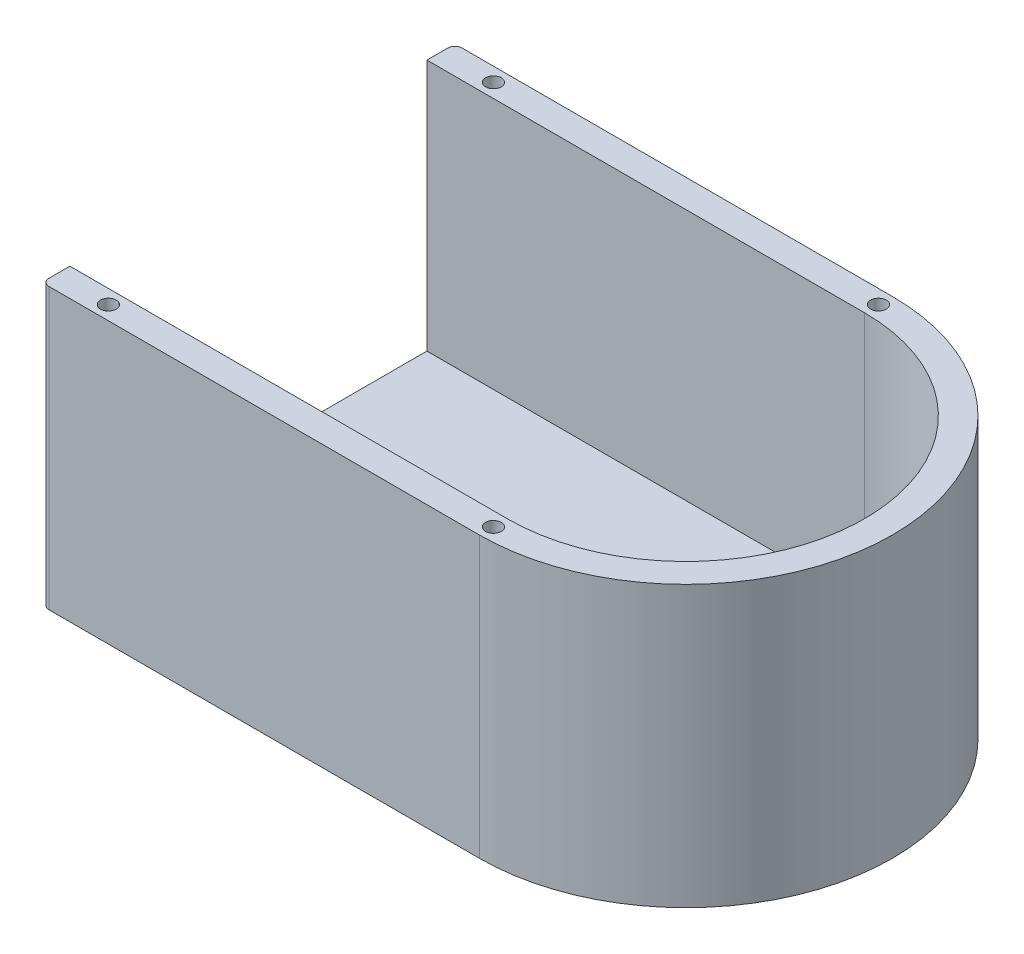
ISO-10303-21;
HEADER;
FILE_DESCRIPTION(('STEP AP214'),'2;1');
FILE_NAME('part.step','',(''),(''),'','','');
FILE_SCHEMA(('AUTOMOTIVE_DESIGN { 1 0 10303 214 1 1 1 1 }'));
ENDSEC;
DATA;
#1=APPLICATION_CONTEXT('core data for automotive mechanical design processes');
#2=APPLICATION_PROTOCOL_DEFINITION('international standard','automotive_design',2000,#1);
#3=PRODUCT_CONTEXT('',#1,'mechanical');
#4=PRODUCT('Part','Part','',(#3));
#5=PRODUCT_RELATED_PRODUCT_CATEGORY('part','',(#4));
#6=PRODUCT_DEFINITION_FORMATION('','',#4);
#7=PRODUCT_DEFINITION_CONTEXT('part definition',#1,'design');
#8=PRODUCT_DEFINITION('design','',#6,#7);
#9=PRODUCT_DEFINITION_SHAPE('','',#8);
#10=(LENGTH_UNIT() NAMED_UNIT(*) SI_UNIT(.MILLI.,.METRE.));
#11=(NAMED_UNIT(*) PLANE_ANGLE_UNIT() SI_UNIT($,.RADIAN.));
#12=(NAMED_UNIT(*) SI_UNIT($,.STERADIAN.) SOLID_ANGLE_UNIT());
#13=UNCERTAINTY_MEASURE_WITH_UNIT(LENGTH_MEASURE(1.E-05),#10,'distance_accuracy_value','');
#14=(GEOMETRIC_REPRESENTATION_CONTEXT(3) GLOBAL_UNCERTAINTY_ASSIGNED_CONTEXT((#13)) GLOBAL_UNIT_ASSIGNED_CONTEXT((#10,
#11,#12)) REPRESENTATION_CONTEXT('',''));
#15=CARTESIAN_POINT('',(0.,0.,0.));
#16=DIRECTION('',(0.,0.,1.));
#17=DIRECTION('',(1.,0.,0.));
#18=AXIS2_PLACEMENT_3D('',#15,#16,#17);
#19=CARTESIAN_POINT('',(-125.,80.,-59.));
#20=DIRECTION('',(1.,0.,0.));
#21=DIRECTION('',(0.,0.,-1.));
#22=AXIS2_PLACEMENT_3D('',#19,#20,#21);
#23=PLANE('',#22);
#24=DIRECTION('',(0.,0.,1.));
#25=VECTOR('',#24,1.);
#26=CARTESIAN_POINT('',(-125.,0.,-59.));
#27=LINE('',#26,#25);
#28=CARTESIAN_POINT('',(-125.,0.,-57.));
#29=VERTEX_POINT('',#28);
#30=CARTESIAN_POINT('',(-125.,0.,57.));
#31=VERTEX_POINT('',#30);
#32=EDGE_CURVE('E197',#29,#31,#27,.T.);
#33=ORIENTED_EDGE('',*,*,#32,.T.);
#34=DIRECTION('',(0.,-1.,0.));
#35=VECTOR('',#34,1.);
#36=CARTESIAN_POINT('',(-125.,80.,57.));
#37=LINE('',#36,#35);
#38=CARTESIAN_POINT('',(-125.,3.96922359359556,57.));
#39=VERTEX_POINT('',#38);
#40=EDGE_CURVE('E608',#31,#39,#37,.F.);
#41=ORIENTED_EDGE('',*,*,#40,.T.);
#42=CARTESIAN_POINT('',(-125.,5.,55.));
#43=DIRECTION('',(-1.,0.,0.));
#44=DIRECTION('',(0.,0.,1.));
#45=AXIS2_PLACEMENT_3D('',#42,#43,#44);
#46=CIRCLE('',#45,2.25);
#47=CARTESIAN_POINT('',(-125.,6.03077640640445,57.));
#48=VERTEX_POINT('',#47);
#49=EDGE_CURVE('E536',#48,#39,#46,.T.);
#50=ORIENTED_EDGE('',*,*,#49,.F.);
#51=DIRECTION('',(0.,-1.,0.));
#52=VECTOR('',#51,1.);
#53=CARTESIAN_POINT('',(-125.,80.,57.));
#54=LINE('',#53,#52);
#55=CARTESIAN_POINT('',(-125.,68.9692235935956,57.));
#56=VERTEX_POINT('',#55);
#57=EDGE_CURVE('E71',#48,#56,#54,.F.);
#58=ORIENTED_EDGE('',*,*,#57,.T.);
#59=CARTESIAN_POINT('',(-125.,70.,55.));
#60=DIRECTION('',(-1.,0.,0.));
#61=DIRECTION('',(0.,0.,1.));
#62=AXIS2_PLACEMENT_3D('',#59,#60,#61);
#63=CIRCLE('',#62,2.25);
#64=CARTESIAN_POINT('',(-125.,71.0307764064045,57.));
#65=VERTEX_POINT('',#64);
#66=EDGE_CURVE('E530',#65,#56,#63,.T.);
#67=ORIENTED_EDGE('',*,*,#66,.F.);
#68=DIRECTION('',(0.,-1.,0.));
#69=VECTOR('',#68,1.);
#70=CARTESIAN_POINT('',(-125.,80.,57.));
#71=LINE('',#70,#69);
#72=CARTESIAN_POINT('',(-125.,80.,57.));
#73=VERTEX_POINT('',#72);
#74=EDGE_CURVE('E65',#65,#73,#71,.F.);
#75=ORIENTED_EDGE('',*,*,#74,.T.);
#76=DIRECTION('',(0.,0.,1.));
#77=VECTOR('',#76,1.);
#78=CARTESIAN_POINT('',(-125.,80.,-59.));
#79=LINE('',#78,#77);
#80=CARTESIAN_POINT('',(-125.,80.,51.));
#81=VERTEX_POINT('',#80);
#82=EDGE_CURVE('E164',#81,#73,#79,.T.);
#83=ORIENTED_EDGE('',*,*,#82,.F.);
#84=DIRECTION('',(0.,-1.,0.));
#85=VECTOR('',#84,1.);
#86=CARTESIAN_POINT('',(-125.,80.,51.));
#87=LINE('',#86,#85);
#88=CARTESIAN_POINT('',(-125.,8.,51.));
#89=VERTEX_POINT('',#88);
#90=EDGE_CURVE('E181',#81,#89,#87,.T.);
#91=ORIENTED_EDGE('',*,*,#90,.T.);
#92=DIRECTION('',(0.,0.,-1.));
#93=VECTOR('',#92,1.);
#94=CARTESIAN_POINT('',(-125.,8.,-51.));
#95=LINE('',#94,#93);
#96=CARTESIAN_POINT('',(-125.,8.,-51.));
#97=VERTEX_POINT('',#96);
#98=EDGE_CURVE('E180',#89,#97,#95,.T.);
#99=ORIENTED_EDGE('',*,*,#98,.T.);
#100=DIRECTION('',(0.,1.,0.));
#101=VECTOR('',#100,1.);
#102=CARTESIAN_POINT('',(-125.,80.,-51.));
#103=LINE('',#102,#101);
#104=CARTESIAN_POINT('',(-125.,80.,-51.));
#105=VERTEX_POINT('',#104);
#106=EDGE_CURVE('E170',#97,#105,#103,.T.);
#107=ORIENTED_EDGE('',*,*,#106,.T.);
#108=CARTESIAN_POINT('',(-125.,80.,-57.));
#109=VERTEX_POINT('',#108);
#110=EDGE_CURVE('E152',#109,#105,#79,.T.);
#111=ORIENTED_EDGE('',*,*,#110,.F.);
#112=DIRECTION('',(0.,-1.,0.));
#113=VECTOR('',#112,1.);
#114=CARTESIAN_POINT('',(-125.,80.,-57.));
#115=LINE('',#114,#113);
#116=CARTESIAN_POINT('',(-125.,71.0307764064044,-57.));
#117=VERTEX_POINT('',#116);
#118=EDGE_CURVE('E228',#109,#117,#115,.T.);
#119=ORIENTED_EDGE('',*,*,#118,.T.);
#120=CARTESIAN_POINT('',(-125.,70.,-55.));
#121=DIRECTION('',(-1.,0.,0.));
#122=DIRECTION('',(0.,0.,1.));
#123=AXIS2_PLACEMENT_3D('',#120,#121,#122);
#124=CIRCLE('',#123,2.25);
#125=CARTESIAN_POINT('',(-125.,68.9692235935956,-57.));
#126=VERTEX_POINT('',#125);
#127=EDGE_CURVE('E186',#126,#117,#124,.T.);
#128=ORIENTED_EDGE('',*,*,#127,.F.);
#129=DIRECTION('',(0.,-1.,0.));
#130=VECTOR('',#129,1.);
#131=CARTESIAN_POINT('',(-125.,80.,-57.));
#132=LINE('',#131,#130);
#133=CARTESIAN_POINT('',(-125.,6.03077640640439,-57.));
#134=VERTEX_POINT('',#133);
#135=EDGE_CURVE('E226',#126,#134,#132,.T.);
#136=ORIENTED_EDGE('',*,*,#135,.T.);
#137=CARTESIAN_POINT('',(-125.,5.,-55.));
#138=DIRECTION('',(-1.,0.,0.));
#139=DIRECTION('',(0.,0.,1.));
#140=AXIS2_PLACEMENT_3D('',#137,#138,#139);
#141=CIRCLE('',#140,2.25);
#142=CARTESIAN_POINT('',(-125.,3.96922359359561,-57.));
#143=VERTEX_POINT('',#142);
#144=EDGE_CURVE('E547',#143,#134,#141,.T.);
#145=ORIENTED_EDGE('',*,*,#144,.F.);
#146=DIRECTION('',(0.,-1.,0.));
#147=VECTOR('',#146,1.);
#148=CARTESIAN_POINT('',(-125.,80.,-57.));
#149=LINE('',#148,#147);
#150=EDGE_CURVE('E224',#143,#29,#149,.T.);
#151=ORIENTED_EDGE('',*,*,#150,.T.);
#152=EDGE_LOOP('',(#33,#41,#50,#58,#67,#75,#83,#91,#99,#107,#111,#119,#128,#136,#145,#151));
#153=FACE_BOUND('',#152,.T.);
#154=ADVANCED_FACE('F49',(#153),#23,.F.);
#155=CARTESIAN_POINT('',(-125.,80.,59.));
#156=DIRECTION('',(0.,0.,-1.));
#157=DIRECTION('',(-1.,0.,0.));
#158=AXIS2_PLACEMENT_3D('',#155,#156,#157);
#159=PLANE('',#158);
#160=DIRECTION('',(1.,0.,0.));
#161=VECTOR('',#160,1.);
#162=CARTESIAN_POINT('',(-125.,80.,59.));
#163=LINE('',#162,#161);
#164=CARTESIAN_POINT('',(-123.,80.,59.));
#165=VERTEX_POINT('',#164);
#166=CARTESIAN_POINT('',(0.,80.,59.));
#167=VERTEX_POINT('',#166);
#168=EDGE_CURVE('E163',#165,#167,#163,.T.);
#169=ORIENTED_EDGE('',*,*,#168,.F.);
#170=DIRECTION('',(0.,-1.,0.));
#171=VECTOR('',#170,1.);
#172=CARTESIAN_POINT('',(-123.,80.,59.));
#173=LINE('',#172,#171);
#174=CARTESIAN_POINT('',(-123.,0.,59.));
#175=VERTEX_POINT('',#174);
#176=EDGE_CURVE('E601',#165,#175,#173,.T.);
#177=ORIENTED_EDGE('',*,*,#176,.T.);
#178=DIRECTION('',(1.,0.,0.));
#179=VECTOR('',#178,1.);
#180=CARTESIAN_POINT('',(-125.,0.,59.));
#181=LINE('',#180,#179);
#182=CARTESIAN_POINT('',(0.,0.,59.));
#183=VERTEX_POINT('',#182);
#184=EDGE_CURVE('E212',#175,#183,#181,.T.);
#185=ORIENTED_EDGE('',*,*,#184,.T.);
#186=DIRECTION('',(0.,-1.,0.));
#187=VECTOR('',#186,1.);
#188=CARTESIAN_POINT('',(0.,80.,59.));
#189=LINE('',#188,#187);
#190=EDGE_CURVE('E221',#167,#183,#189,.T.);
#191=ORIENTED_EDGE('',*,*,#190,.F.);
#192=EDGE_LOOP('',(#169,#177,#185,#191));
#193=FACE_BOUND('',#192,.T.);
#194=ADVANCED_FACE('F283',(#193),#159,.F.);
#195=CARTESIAN_POINT('',(0.,80.,0.));
#196=DIRECTION('',(0.,-1.,0.));
#197=DIRECTION('',(0.,0.,-1.));
#198=AXIS2_PLACEMENT_3D('',#195,#196,#197);
#199=CYLINDRICAL_SURFACE('',#198,59.);
#200=CARTESIAN_POINT('',(0.,0.,0.));
#201=DIRECTION('',(0.,1.,0.));
#202=DIRECTION('',(0.,0.,1.));
#203=AXIS2_PLACEMENT_3D('',#200,#201,#202);
#204=CIRCLE('',#203,59.);
#205=CARTESIAN_POINT('',(0.,0.,-59.));
#206=VERTEX_POINT('',#205);
#207=EDGE_CURVE('E214',#183,#206,#204,.T.);
#208=ORIENTED_EDGE('',*,*,#207,.T.);
#209=DIRECTION('',(0.,-1.,0.));
#210=VECTOR('',#209,1.);
#211=CARTESIAN_POINT('',(0.,80.,-59.));
#212=LINE('',#211,#210);
#213=CARTESIAN_POINT('',(0.,80.,-59.));
#214=VERTEX_POINT('',#213);
#215=EDGE_CURVE('E210',#214,#206,#212,.T.);
#216=ORIENTED_EDGE('',*,*,#215,.F.);
#217=CARTESIAN_POINT('',(0.,80.,0.));
#218=DIRECTION('',(0.,1.,0.));
#219=DIRECTION('',(0.,0.,1.));
#220=AXIS2_PLACEMENT_3D('',#217,#218,#219);
#221=CIRCLE('',#220,59.);
#222=EDGE_CURVE('E206',#167,#214,#221,.T.);
#223=ORIENTED_EDGE('',*,*,#222,.F.);
#224=ORIENTED_EDGE('',*,*,#190,.T.);
#225=EDGE_LOOP('',(#208,#216,#223,#224));
#226=FACE_BOUND('',#225,.T.);
#227=ADVANCED_FACE('F279',(#226),#199,.T.);
#228=CARTESIAN_POINT('',(-125.,80.,-59.));
#229=DIRECTION('',(0.,0.,1.));
#230=DIRECTION('',(1.,0.,0.));
#231=AXIS2_PLACEMENT_3D('',#228,#229,#230);
#232=PLANE('',#231);
#233=DIRECTION('',(-1.,0.,0.));
#234=VECTOR('',#233,1.);
#235=CARTESIAN_POINT('',(-125.,0.,-59.));
#236=LINE('',#235,#234);
#237=CARTESIAN_POINT('',(-123.,0.,-59.));
#238=VERTEX_POINT('',#237);
#239=EDGE_CURVE('E216',#206,#238,#236,.T.);
#240=ORIENTED_EDGE('',*,*,#239,.T.);
#241=DIRECTION('',(0.,-1.,0.));
#242=VECTOR('',#241,1.);
#243=CARTESIAN_POINT('',(-123.,80.,-59.));
#244=LINE('',#243,#242);
#245=CARTESIAN_POINT('',(-123.,80.,-59.));
#246=VERTEX_POINT('',#245);
#247=EDGE_CURVE('E595',#238,#246,#244,.F.);
#248=ORIENTED_EDGE('',*,*,#247,.T.);
#249=DIRECTION('',(-1.,0.,0.));
#250=VECTOR('',#249,1.);
#251=CARTESIAN_POINT('',(-125.,80.,-59.));
#252=LINE('',#251,#250);
#253=EDGE_CURVE('E208',#214,#246,#252,.T.);
#254=ORIENTED_EDGE('',*,*,#253,.F.);
#255=ORIENTED_EDGE('',*,*,#215,.T.);
#256=EDGE_LOOP('',(#240,#248,#254,#255));
#257=FACE_BOUND('',#256,.T.);
#258=ADVANCED_FACE('F272',(#257),#232,.F.);
#259=CARTESIAN_POINT('',(0.,80.,0.));
#260=DIRECTION('',(0.,1.,0.));
#261=DIRECTION('',(0.,0.,1.));
#262=AXIS2_PLACEMENT_3D('',#259,#260,#261);
#263=PLANE('',#262);
#264=CARTESIAN_POINT('',(0.,80.,55.));
#265=DIRECTION('',(0.,1.,0.));
#266=DIRECTION('',(0.,0.,1.));
#267=AXIS2_PLACEMENT_3D('',#264,#265,#266);
#268=CIRCLE('',#267,2.25);
#269=CARTESIAN_POINT('',(0.,80.,57.25));
#270=VERTEX_POINT('',#269);
#271=EDGE_CURVE('E562',#270,#270,#268,.T.);
#272=ORIENTED_EDGE('',*,*,#271,.F.);
#273=EDGE_LOOP('',(#272));
#274=FACE_BOUND('',#273,.T.);
#275=CARTESIAN_POINT('',(-110.,80.,55.));
#276=DIRECTION('',(0.,1.,0.));
#277=DIRECTION('',(0.,0.,1.));
#278=AXIS2_PLACEMENT_3D('',#275,#276,#277);
#279=CIRCLE('',#278,2.25);
#280=CARTESIAN_POINT('',(-110.,80.,57.25));
#281=VERTEX_POINT('',#280);
#282=EDGE_CURVE('E568',#281,#281,#279,.T.);
#283=ORIENTED_EDGE('',*,*,#282,.F.);
#284=EDGE_LOOP('',(#283));
#285=FACE_BOUND('',#284,.T.);
#286=CARTESIAN_POINT('',(-110.,80.,-55.));
#287=DIRECTION('',(0.,1.,0.));
#288=DIRECTION('',(0.,0.,1.));
#289=AXIS2_PLACEMENT_3D('',#286,#287,#288);
#290=CIRCLE('',#289,2.25);
#291=CARTESIAN_POINT('',(-110.,80.,-52.75));
#292=VERTEX_POINT('',#291);
#293=EDGE_CURVE('E557',#292,#292,#290,.T.);
#294=ORIENTED_EDGE('',*,*,#293,.F.);
#295=EDGE_LOOP('',(#294));
#296=FACE_BOUND('',#295,.T.);
#297=CARTESIAN_POINT('',(0.,80.,-55.));
#298=DIRECTION('',(0.,1.,0.));
#299=DIRECTION('',(0.,0.,1.));
#300=AXIS2_PLACEMENT_3D('',#297,#298,#299);
#301=CIRCLE('',#300,2.25);
#302=CARTESIAN_POINT('',(0.,80.,-52.75));
#303=VERTEX_POINT('',#302);
#304=EDGE_CURVE('E539',#303,#303,#301,.T.);
#305=ORIENTED_EDGE('',*,*,#304,.F.);
#306=EDGE_LOOP('',(#305));
#307=FACE_BOUND('',#306,.T.);
#308=ORIENTED_EDGE('',*,*,#82,.T.);
#309=CARTESIAN_POINT('',(-123.,80.,57.));
#310=DIRECTION('',(0.,1.,0.));
#311=DIRECTION('',(0.,0.,1.));
#312=AXIS2_PLACEMENT_3D('',#309,#310,#311);
#313=CIRCLE('',#312,2.);
#314=EDGE_CURVE('E12',#73,#165,#313,.T.);
#315=ORIENTED_EDGE('',*,*,#314,.T.);
#316=ORIENTED_EDGE('',*,*,#168,.T.);
#317=ORIENTED_EDGE('',*,*,#222,.T.);
#318=ORIENTED_EDGE('',*,*,#253,.T.);
#319=CARTESIAN_POINT('',(-123.,80.,-57.));
#320=DIRECTION('',(0.,1.,0.));
#321=DIRECTION('',(0.,0.,1.));
#322=AXIS2_PLACEMENT_3D('',#319,#320,#321);
#323=CIRCLE('',#322,2.);
#324=EDGE_CURVE('E159',#246,#109,#323,.T.);
#325=ORIENTED_EDGE('',*,*,#324,.T.);
#326=ORIENTED_EDGE('',*,*,#110,.T.);
#327=DIRECTION('',(-1.,0.,0.));
#328=VECTOR('',#327,1.);
#329=CARTESIAN_POINT('',(-125.,80.,-51.));
#330=LINE('',#329,#328);
#331=CARTESIAN_POINT('',(0.,80.,-51.));
#332=VERTEX_POINT('',#331);
#333=EDGE_CURVE('E156',#332,#105,#330,.T.);
#334=ORIENTED_EDGE('',*,*,#333,.F.);
#335=CARTESIAN_POINT('',(0.,80.,0.));
#336=DIRECTION('',(0.,1.,0.));
#337=DIRECTION('',(0.,0.,1.));
#338=AXIS2_PLACEMENT_3D('',#335,#336,#337);
#339=CIRCLE('',#338,51.);
#340=CARTESIAN_POINT('',(0.,80.,51.));
#341=VERTEX_POINT('',#340);
#342=EDGE_CURVE('E175',#341,#332,#339,.T.);
#343=ORIENTED_EDGE('',*,*,#342,.F.);
#344=DIRECTION('',(1.,0.,0.));
#345=VECTOR('',#344,1.);
#346=CARTESIAN_POINT('',(-125.,80.,51.));
#347=LINE('',#346,#345);
#348=EDGE_CURVE('E202',#81,#341,#347,.T.);
#349=ORIENTED_EDGE('',*,*,#348,.F.);
#350=EDGE_LOOP('',(#308,#315,#316,#317,#318,#325,#326,#334,#343,#349));
#351=FACE_BOUND('',#350,.T.);
#352=ADVANCED_FACE('F154',(#274,#285,#296,#307,#351),#263,.T.);
#353=CARTESIAN_POINT('',(0.,0.,0.));
#354=DIRECTION('',(0.,1.,0.));
#355=DIRECTION('',(0.,0.,1.));
#356=AXIS2_PLACEMENT_3D('',#353,#354,#355);
#357=PLANE('',#356);
#358=ORIENTED_EDGE('',*,*,#184,.F.);
#359=CARTESIAN_POINT('',(-123.,0.,57.));
#360=DIRECTION('',(0.,1.,0.));
#361=DIRECTION('',(0.,0.,1.));
#362=AXIS2_PLACEMENT_3D('',#359,#360,#361);
#363=CIRCLE('',#362,2.);
#364=EDGE_CURVE('E604',#175,#31,#363,.F.);
#365=ORIENTED_EDGE('',*,*,#364,.T.);
#366=ORIENTED_EDGE('',*,*,#32,.F.);
#367=CARTESIAN_POINT('',(-123.,0.,-57.));
#368=DIRECTION('',(0.,1.,0.));
#369=DIRECTION('',(0.,0.,1.));
#370=AXIS2_PLACEMENT_3D('',#367,#368,#369);
#371=CIRCLE('',#370,2.);
#372=EDGE_CURVE('E594',#29,#238,#371,.F.);
#373=ORIENTED_EDGE('',*,*,#372,.T.);
#374=ORIENTED_EDGE('',*,*,#239,.F.);
#375=ORIENTED_EDGE('',*,*,#207,.F.);
#376=EDGE_LOOP('',(#358,#365,#366,#373,#374,#375));
#377=FACE_BOUND('',#376,.T.);
#378=ADVANCED_FACE('F260',(#377),#357,.F.);
#379=CARTESIAN_POINT('',(-125.,80.,51.));
#380=DIRECTION('',(0.,0.,-1.));
#381=DIRECTION('',(-1.,0.,0.));
#382=AXIS2_PLACEMENT_3D('',#379,#380,#381);
#383=PLANE('',#382);
#384=DIRECTION('',(1.,0.,0.));
#385=VECTOR('',#384,1.);
#386=CARTESIAN_POINT('',(-125.,8.00000000000001,51.));
#387=LINE('',#386,#385);
#388=CARTESIAN_POINT('',(0.,8.00000000000001,51.));
#389=VERTEX_POINT('',#388);
#390=EDGE_CURVE('E191',#89,#389,#387,.T.);
#391=ORIENTED_EDGE('',*,*,#390,.F.);
#392=ORIENTED_EDGE('',*,*,#90,.F.);
#393=ORIENTED_EDGE('',*,*,#348,.T.);
#394=DIRECTION('',(0.,-1.,0.));
#395=VECTOR('',#394,1.);
#396=CARTESIAN_POINT('',(0.,80.,51.));
#397=LINE('',#396,#395);
#398=EDGE_CURVE('E194',#341,#389,#397,.T.);
#399=ORIENTED_EDGE('',*,*,#398,.T.);
#400=EDGE_LOOP('',(#391,#392,#393,#399));
#401=FACE_BOUND('',#400,.T.);
#402=ADVANCED_FACE('F256',(#401),#383,.T.);
#403=CARTESIAN_POINT('',(0.,80.,0.));
#404=DIRECTION('',(0.,-1.,0.));
#405=DIRECTION('',(0.,0.,-1.));
#406=AXIS2_PLACEMENT_3D('',#403,#404,#405);
#407=CYLINDRICAL_SURFACE('',#406,51.);
#408=CARTESIAN_POINT('',(0.,8.00000000000001,0.));
#409=DIRECTION('',(0.,1.,0.));
#410=DIRECTION('',(0.,0.,1.));
#411=AXIS2_PLACEMENT_3D('',#408,#409,#410);
#412=CIRCLE('',#411,51.);
#413=CARTESIAN_POINT('',(0.,8.00000000000001,-51.));
#414=VERTEX_POINT('',#413);
#415=EDGE_CURVE('E193',#389,#414,#412,.T.);
#416=ORIENTED_EDGE('',*,*,#415,.F.);
#417=ORIENTED_EDGE('',*,*,#398,.F.);
#418=ORIENTED_EDGE('',*,*,#342,.T.);
#419=DIRECTION('',(0.,1.,0.));
#420=VECTOR('',#419,1.);
#421=CARTESIAN_POINT('',(0.,80.,-51.));
#422=LINE('',#421,#420);
#423=EDGE_CURVE('E173',#332,#414,#422,.F.);
#424=ORIENTED_EDGE('',*,*,#423,.T.);
#425=EDGE_LOOP('',(#416,#417,#418,#424));
#426=FACE_BOUND('',#425,.T.);
#427=ADVANCED_FACE('F259',(#426),#407,.F.);
#428=CARTESIAN_POINT('',(-125.,80.,-51.));
#429=DIRECTION('',(0.,0.,1.));
#430=DIRECTION('',(1.,0.,0.));
#431=AXIS2_PLACEMENT_3D('',#428,#429,#430);
#432=PLANE('',#431);
#433=DIRECTION('',(-1.,0.,0.));
#434=VECTOR('',#433,1.);
#435=CARTESIAN_POINT('',(-125.,8.00000000000001,-51.));
#436=LINE('',#435,#434);
#437=EDGE_CURVE('E199',#414,#97,#436,.T.);
#438=ORIENTED_EDGE('',*,*,#437,.F.);
#439=ORIENTED_EDGE('',*,*,#423,.F.);
#440=ORIENTED_EDGE('',*,*,#333,.T.);
#441=ORIENTED_EDGE('',*,*,#106,.F.);
#442=EDGE_LOOP('',(#438,#439,#440,#441));
#443=FACE_BOUND('',#442,.T.);
#444=ADVANCED_FACE('F169',(#443),#432,.T.);
#445=CARTESIAN_POINT('',(0.,8.,0.));
#446=DIRECTION('',(0.,1.,0.));
#447=DIRECTION('',(0.,0.,1.));
#448=AXIS2_PLACEMENT_3D('',#445,#446,#447);
#449=PLANE('',#448);
#450=ORIENTED_EDGE('',*,*,#390,.T.);
#451=ORIENTED_EDGE('',*,*,#415,.T.);
#452=ORIENTED_EDGE('',*,*,#437,.T.);
#453=ORIENTED_EDGE('',*,*,#98,.F.);
#454=EDGE_LOOP('',(#450,#451,#452,#453));
#455=FACE_BOUND('',#454,.T.);
#456=ADVANCED_FACE('F253',(#455),#449,.T.);
#457=CARTESIAN_POINT('',(-119.,70.,-55.));
#458=DIRECTION('',(-1.,0.,0.));
#459=DIRECTION('',(0.,0.,1.));
#460=AXIS2_PLACEMENT_3D('',#457,#458,#459);
#461=CYLINDRICAL_SURFACE('',#460,2.25);
#462=CARTESIAN_POINT('',(-119.,70.,-55.));
#463=DIRECTION('',(-1.,0.,0.));
#464=DIRECTION('',(0.,0.,1.));
#465=AXIS2_PLACEMENT_3D('',#462,#463,#464);
#466=CIRCLE('',#465,2.25);
#467=CARTESIAN_POINT('',(-119.,70.,-52.75));
#468=VERTEX_POINT('',#467);
#469=EDGE_CURVE('E182',#468,#468,#466,.T.);
#470=ORIENTED_EDGE('',*,*,#469,.F.);
#471=EDGE_LOOP('',(#470));
#472=FACE_BOUND('',#471,.T.);
#473=ORIENTED_EDGE('',*,*,#127,.T.);
#474=CARTESIAN_POINT('',(-125.,71.0307764064044,-57.));
#475=CARTESIAN_POINT('',(-124.9999847442,70.9746026489289,-57.0289586212277));
#476=CARTESIAN_POINT('',(-124.999370372143,70.917210365035,-57.0555353556963));
#477=CARTESIAN_POINT('',(-124.997456268133,70.8004086512758,-57.1037656572349));
#478=CARTESIAN_POINT('',(-124.996156593355,70.7409993900765,-57.1254196348011));
#479=CARTESIAN_POINT('',(-124.993386246525,70.6206463926766,-57.1636269681991));
#480=CARTESIAN_POINT('',(-124.991915781596,70.5597045839315,-57.180186415209));
#481=CARTESIAN_POINT('',(-124.989191180636,70.4366411496922,-57.2081270625543));
#482=CARTESIAN_POINT('',(-124.987937040626,70.3745195459183,-57.2195083581237));
#483=CARTESIAN_POINT('',(-124.985925627424,70.2494843222637,-57.2370171017528));
#484=CARTESIAN_POINT('',(-124.98516872451,70.1865701476288,-57.2431406355481));
#485=CARTESIAN_POINT('',(-124.984306992272,70.0604223911954,-57.2500758834623));
#486=CARTESIAN_POINT('',(-124.984202406622,69.9971886988673,-57.2508856126126));
#487=CARTESIAN_POINT('',(-124.984667629985,69.8709241632816,-57.2471812819442));
#488=CARTESIAN_POINT('',(-124.985236926376,69.8078932023596,-57.2426712688781));
#489=CARTESIAN_POINT('',(-124.986930911263,69.6824368273239,-57.2283729631819));
#490=CARTESIAN_POINT('',(-124.988055773768,69.6200116091855,-57.2185830167332));
#491=CARTESIAN_POINT('',(-124.991472490987,69.4558311283752,-57.1856885556169));
#492=CARTESIAN_POINT('',(-124.994047289183,69.3549350048389,-57.1580651499093));
#493=CARTESIAN_POINT('',(-124.997241556897,69.2072725005535,-57.1063748007762));
#494=CARTESIAN_POINT('',(-124.998195185238,69.1586506216914,-57.0874279321415));
#495=CARTESIAN_POINT('',(-124.999572268012,69.0628241136864,-57.0461961293246));
#496=CARTESIAN_POINT('',(-124.999995611026,69.0156197844154,-57.0239104947407));
#497=CARTESIAN_POINT('',(-125.,68.9692235935956,-57.));
#498=B_SPLINE_CURVE_WITH_KNOTS('',3,(#474,#475,#476,#477,#478,#479,#480,#481,#482,#483,#484,
#485,#486,#487,#488,#489,#490,#491,#492,#493,#494,#495,#496,#497),.UNSPECIFIED.,.F.,.F.,(4,2,2,
2,2,2,2,2,2,2,2,4),(0.,0.189526602351566,0.379037394758006,0.568320713639343,0.757600551168471,
0.947021180636789,1.13651256404111,1.32585989338829,1.51526656594336,1.82800916052709,
1.98447854453792,2.14098079856727),.UNSPECIFIED.);
#499=EDGE_CURVE('E230',#117,#126,#498,.T.);
#500=ORIENTED_EDGE('',*,*,#499,.T.);
#501=EDGE_LOOP('',(#473,#500));
#502=FACE_BOUND('',#501,.T.);
#503=ADVANCED_FACE('F247',(#472,#502),#461,.F.);
#504=CARTESIAN_POINT('',(-119.,70.,-55.));
#505=DIRECTION('',(-1.,0.,0.));
#506=DIRECTION('',(0.,0.,1.));
#507=AXIS2_PLACEMENT_3D('',#504,#505,#506);
#508=PLANE('',#507);
#509=ORIENTED_EDGE('',*,*,#469,.T.);
#510=EDGE_LOOP('',(#509));
#511=FACE_BOUND('',#510,.T.);
#512=ADVANCED_FACE('F252',(#511),#508,.T.);
#513=CARTESIAN_POINT('',(-119.,70.,55.));
#514=DIRECTION('',(-1.,0.,0.));
#515=DIRECTION('',(0.,0.,1.));
#516=AXIS2_PLACEMENT_3D('',#513,#514,#515);
#517=CYLINDRICAL_SURFACE('',#516,2.25);
#518=CARTESIAN_POINT('',(-119.,70.,55.));
#519=DIRECTION('',(-1.,0.,0.));
#520=DIRECTION('',(0.,0.,1.));
#521=AXIS2_PLACEMENT_3D('',#518,#519,#520);
#522=CIRCLE('',#521,2.25);
#523=CARTESIAN_POINT('',(-119.,70.,57.25));
#524=VERTEX_POINT('',#523);
#525=EDGE_CURVE('E531',#524,#524,#522,.T.);
#526=ORIENTED_EDGE('',*,*,#525,.F.);
#527=EDGE_LOOP('',(#526));
#528=FACE_BOUND('',#527,.T.);
#529=ORIENTED_EDGE('',*,*,#66,.T.);
#530=CARTESIAN_POINT('',(-125.,68.9692235935956,57.));
#531=CARTESIAN_POINT('',(-124.9999847442,69.025397351071,57.0289586212277));
#532=CARTESIAN_POINT('',(-124.999370372143,69.082789634965,57.0555353556963));
#533=CARTESIAN_POINT('',(-124.997456268133,69.1995913487242,57.1037656572349));
#534=CARTESIAN_POINT('',(-124.996156593355,69.2590006099235,57.1254196348011));
#535=CARTESIAN_POINT('',(-124.993386246525,69.3793536073234,57.1636269681991));
#536=CARTESIAN_POINT('',(-124.991915781596,69.4402954160685,57.180186415209));
#537=CARTESIAN_POINT('',(-124.989191180636,69.5633588503077,57.2081270625543));
#538=CARTESIAN_POINT('',(-124.987937040626,69.6254804540817,57.2195083581238));
#539=CARTESIAN_POINT('',(-124.985925627424,69.7505156777363,57.2370171017528));
#540=CARTESIAN_POINT('',(-124.98516872451,69.8134298523711,57.2431406355482));
#541=CARTESIAN_POINT('',(-124.984306992272,69.9395776088045,57.2500758834623));
#542=CARTESIAN_POINT('',(-124.984202406622,70.0028113011326,57.2508856126126));
#543=CARTESIAN_POINT('',(-124.984667629985,70.1290758367184,57.2471812819442));
#544=CARTESIAN_POINT('',(-124.985236926376,70.1921067976404,57.2426712688781));
#545=CARTESIAN_POINT('',(-124.986930911263,70.317563172676,57.228372963182));
#546=CARTESIAN_POINT('',(-124.988055773768,70.3799883908145,57.2185830167333));
#547=CARTESIAN_POINT('',(-124.991472490987,70.5441688716248,57.185688555617));
#548=CARTESIAN_POINT('',(-124.994047289183,70.6450649951611,57.1580651499093));
#549=CARTESIAN_POINT('',(-124.997241556897,70.7927274994465,57.1063748007762));
#550=CARTESIAN_POINT('',(-124.998195185238,70.8413493783086,57.0874279321415));
#551=CARTESIAN_POINT('',(-124.999572268012,70.9371758863136,57.0461961293246));
#552=CARTESIAN_POINT('',(-124.999995611026,70.9843802155847,57.0239104947407));
#553=CARTESIAN_POINT('',(-125.,71.0307764064045,57.));
#554=B_SPLINE_CURVE_WITH_KNOTS('',3,(#530,#531,#532,#533,#534,#535,#536,#537,#538,#539,#540,
#541,#542,#543,#544,#545,#546,#547,#548,#549,#550,#551,#552,#553),.UNSPECIFIED.,.F.,.F.,(4,2,2,
2,2,2,2,2,2,2,2,4),(0.,0.189526602351572,0.379037394758009,0.56832071363935,0.757600551168465,
0.947021180636769,1.13651256404109,1.32585989338826,1.51526656594334,1.82800916052713,
1.98447854453799,2.14098079856738),.UNSPECIFIED.);
#555=EDGE_CURVE('E58',#56,#65,#554,.T.);
#556=ORIENTED_EDGE('',*,*,#555,.T.);
#557=EDGE_LOOP('',(#529,#556));
#558=FACE_BOUND('',#557,.T.);
#559=ADVANCED_FACE('F316',(#528,#558),#517,.F.);
#560=CARTESIAN_POINT('',(-119.,70.,55.));
#561=DIRECTION('',(-1.,0.,0.));
#562=DIRECTION('',(0.,0.,1.));
#563=AXIS2_PLACEMENT_3D('',#560,#561,#562);
#564=PLANE('',#563);
#565=ORIENTED_EDGE('',*,*,#525,.T.);
#566=EDGE_LOOP('',(#565));
#567=FACE_BOUND('',#566,.T.);
#568=ADVANCED_FACE('F320',(#567),#564,.T.);
#569=CARTESIAN_POINT('',(-119.,5.,55.));
#570=DIRECTION('',(-1.,0.,0.));
#571=DIRECTION('',(0.,0.,1.));
#572=AXIS2_PLACEMENT_3D('',#569,#570,#571);
#573=CYLINDRICAL_SURFACE('',#572,2.25);
#574=CARTESIAN_POINT('',(-119.,5.,55.));
#575=DIRECTION('',(-1.,0.,0.));
#576=DIRECTION('',(0.,0.,1.));
#577=AXIS2_PLACEMENT_3D('',#574,#575,#576);
#578=CIRCLE('',#577,2.25);
#579=CARTESIAN_POINT('',(-119.,5.,57.25));
#580=VERTEX_POINT('',#579);
#581=EDGE_CURVE('E544',#580,#580,#578,.T.);
#582=ORIENTED_EDGE('',*,*,#581,.F.);
#583=EDGE_LOOP('',(#582));
#584=FACE_BOUND('',#583,.T.);
#585=ORIENTED_EDGE('',*,*,#49,.T.);
#586=CARTESIAN_POINT('',(-125.,3.96922359359556,57.));
#587=CARTESIAN_POINT('',(-124.9999847442,4.02539735107103,57.0289586212277));
#588=CARTESIAN_POINT('',(-124.999370372143,4.08278963496502,57.0555353556963));
#589=CARTESIAN_POINT('',(-124.997456268133,4.19959134872417,57.1037656572349));
#590=CARTESIAN_POINT('',(-124.996156593355,4.25900060992352,57.1254196348011));
#591=CARTESIAN_POINT('',(-124.993386246525,4.37935360732338,57.1636269681991));
#592=CARTESIAN_POINT('',(-124.991915781596,4.4402954160685,57.180186415209));
#593=CARTESIAN_POINT('',(-124.989191180636,4.56335885030772,57.2081270625543));
#594=CARTESIAN_POINT('',(-124.987937040626,4.62548045408169,57.2195083581238));
#595=CARTESIAN_POINT('',(-124.985925627424,4.75051567773629,57.2370171017528));
#596=CARTESIAN_POINT('',(-124.98516872451,4.81342985237113,57.2431406355482));
#597=CARTESIAN_POINT('',(-124.984306992272,4.93957760880451,57.2500758834623));
#598=CARTESIAN_POINT('',(-124.984202406622,5.00281130113262,57.2508856126126));
#599=CARTESIAN_POINT('',(-124.984667629985,5.12907583671836,57.2471812819442));
#600=CARTESIAN_POINT('',(-124.985236926376,5.19210679764037,57.2426712688781));
#601=CARTESIAN_POINT('',(-124.986930911263,5.31756317267603,57.228372963182));
#602=CARTESIAN_POINT('',(-124.988055773768,5.37998839081445,57.2185830167333));
#603=CARTESIAN_POINT('',(-124.991472490987,5.5441688716248,57.185688555617));
#604=CARTESIAN_POINT('',(-124.994047289183,5.64506499516112,57.1580651499093));
#605=CARTESIAN_POINT('',(-124.997241556897,5.79272749944651,57.1063748007762));
#606=CARTESIAN_POINT('',(-124.998195185238,5.84134937830861,57.0874279321415));
#607=CARTESIAN_POINT('',(-124.999572268012,5.93717588631363,57.0461961293246));
#608=CARTESIAN_POINT('',(-124.999995611026,5.98438021558469,57.0239104947407));
#609=CARTESIAN_POINT('',(-125.,6.03077640640445,57.));
#610=B_SPLINE_CURVE_WITH_KNOTS('',3,(#586,#587,#588,#589,#590,#591,#592,#593,#594,#595,#596,
#597,#598,#599,#600,#601,#602,#603,#604,#605,#606,#607,#608,#609),.UNSPECIFIED.,.F.,.F.,(4,2,2,
2,2,2,2,2,2,2,2,4),(0.,0.18952660235157,0.379037394758001,0.568320713639346,0.75760055116847,
0.947021180636784,1.1365125640411,1.32585989338828,1.51526656594335,1.82800916052714,
1.984478544538,2.14098079856737),.UNSPECIFIED.);
#611=EDGE_CURVE('E610',#39,#48,#610,.T.);
#612=ORIENTED_EDGE('',*,*,#611,.T.);
#613=EDGE_LOOP('',(#585,#612));
#614=FACE_BOUND('',#613,.T.);
#615=ADVANCED_FACE('F328',(#584,#614),#573,.F.);
#616=CARTESIAN_POINT('',(-119.,5.,55.));
#617=DIRECTION('',(-1.,0.,0.));
#618=DIRECTION('',(0.,0.,1.));
#619=AXIS2_PLACEMENT_3D('',#616,#617,#618);
#620=PLANE('',#619);
#621=ORIENTED_EDGE('',*,*,#581,.T.);
#622=EDGE_LOOP('',(#621));
#623=FACE_BOUND('',#622,.T.);
#624=ADVANCED_FACE('F332',(#623),#620,.T.);
#625=CARTESIAN_POINT('',(-119.,5.,-55.));
#626=DIRECTION('',(-1.,0.,0.));
#627=DIRECTION('',(0.,0.,1.));
#628=AXIS2_PLACEMENT_3D('',#625,#626,#627);
#629=CYLINDRICAL_SURFACE('',#628,2.25);
#630=CARTESIAN_POINT('',(-119.,5.,-55.));
#631=DIRECTION('',(-1.,0.,0.));
#632=DIRECTION('',(0.,0.,1.));
#633=AXIS2_PLACEMENT_3D('',#630,#631,#632);
#634=CIRCLE('',#633,2.25);
#635=CARTESIAN_POINT('',(-119.,5.,-52.75));
#636=VERTEX_POINT('',#635);
#637=EDGE_CURVE('E550',#636,#636,#634,.T.);
#638=ORIENTED_EDGE('',*,*,#637,.F.);
#639=EDGE_LOOP('',(#638));
#640=FACE_BOUND('',#639,.T.);
#641=ORIENTED_EDGE('',*,*,#144,.T.);
#642=CARTESIAN_POINT('',(-125.,6.03077640640439,-57.));
#643=CARTESIAN_POINT('',(-124.9999847442,5.97460264892892,-57.0289586212277));
#644=CARTESIAN_POINT('',(-124.999370372143,5.91721036503493,-57.0555353556963));
#645=CARTESIAN_POINT('',(-124.997456268133,5.80040865127578,-57.1037656572349));
#646=CARTESIAN_POINT('',(-124.996156593355,5.74099939007643,-57.1254196348011));
#647=CARTESIAN_POINT('',(-124.993386246525,5.62064639267657,-57.1636269681991));
#648=CARTESIAN_POINT('',(-124.991915781596,5.55970458393145,-57.180186415209));
#649=CARTESIAN_POINT('',(-124.989191180636,5.43664114969222,-57.2081270625543));
#650=CARTESIAN_POINT('',(-124.987937040626,5.37451954591826,-57.2195083581237));
#651=CARTESIAN_POINT('',(-124.985925627424,5.24948432226365,-57.2370171017528));
#652=CARTESIAN_POINT('',(-124.98516872451,5.18657014762881,-57.2431406355481));
#653=CARTESIAN_POINT('',(-124.984306992272,5.06042239119543,-57.2500758834623));
#654=CARTESIAN_POINT('',(-124.984202406622,4.99718869886732,-57.2508856126126));
#655=CARTESIAN_POINT('',(-124.984667629985,4.87092416328158,-57.2471812819442));
#656=CARTESIAN_POINT('',(-124.985236926376,4.80789320235957,-57.2426712688781));
#657=CARTESIAN_POINT('',(-124.986930911263,4.68243682732392,-57.2283729631819));
#658=CARTESIAN_POINT('',(-124.988055773768,4.62001160918549,-57.2185830167332));
#659=CARTESIAN_POINT('',(-124.991472490987,4.45583112837516,-57.1856885556169));
#660=CARTESIAN_POINT('',(-124.994047289183,4.35493500483886,-57.1580651499093));
#661=CARTESIAN_POINT('',(-124.997241556897,4.2072725005535,-57.1063748007762));
#662=CARTESIAN_POINT('',(-124.998195185238,4.15865062169141,-57.0874279321415));
#663=CARTESIAN_POINT('',(-124.999572268012,4.06282411368642,-57.0461961293246));
#664=CARTESIAN_POINT('',(-124.999995611026,4.01561978441536,-57.0239104947407));
#665=CARTESIAN_POINT('',(-125.,3.96922359359561,-57.));
#666=B_SPLINE_CURVE_WITH_KNOTS('',3,(#642,#643,#644,#645,#646,#647,#648,#649,#650,#651,#652,
#653,#654,#655,#656,#657,#658,#659,#660,#661,#662,#663,#664,#665),.UNSPECIFIED.,.F.,.F.,(4,2,2,
2,2,2,2,2,2,2,2,4),(0.,0.18952660235157,0.379037394758002,0.568320713639345,0.757600551168471,
0.947021180636785,1.1365125640411,1.32585989338828,1.51526656594335,1.82800916052708,
1.9844785445379,2.14098079856725),.UNSPECIFIED.);
#667=EDGE_CURVE('E237',#134,#143,#666,.T.);
#668=ORIENTED_EDGE('',*,*,#667,.T.);
#669=EDGE_LOOP('',(#641,#668));
#670=FACE_BOUND('',#669,.T.);
#671=ADVANCED_FACE('F438',(#640,#670),#629,.F.);
#672=CARTESIAN_POINT('',(-119.,5.,-55.));
#673=DIRECTION('',(-1.,0.,0.));
#674=DIRECTION('',(0.,0.,1.));
#675=AXIS2_PLACEMENT_3D('',#672,#673,#674);
#676=PLANE('',#675);
#677=ORIENTED_EDGE('',*,*,#637,.T.);
#678=EDGE_LOOP('',(#677));
#679=FACE_BOUND('',#678,.T.);
#680=ADVANCED_FACE('F428',(#679),#676,.T.);
#681=CARTESIAN_POINT('',(0.,74.,-55.));
#682=DIRECTION('',(0.,1.,0.));
#683=DIRECTION('',(0.,0.,1.));
#684=AXIS2_PLACEMENT_3D('',#681,#682,#683);
#685=CYLINDRICAL_SURFACE('',#684,2.25);
#686=CARTESIAN_POINT('',(0.,74.,-55.));
#687=DIRECTION('',(0.,1.,0.));
#688=DIRECTION('',(0.,0.,1.));
#689=AXIS2_PLACEMENT_3D('',#686,#687,#688);
#690=CIRCLE('',#689,2.25);
#691=CARTESIAN_POINT('',(0.,74.,-52.75));
#692=VERTEX_POINT('',#691);
#693=EDGE_CURVE('E552',#692,#692,#690,.T.);
#694=ORIENTED_EDGE('',*,*,#693,.F.);
#695=EDGE_LOOP('',(#694));
#696=FACE_BOUND('',#695,.T.);
#697=ORIENTED_EDGE('',*,*,#304,.T.);
#698=EDGE_LOOP('',(#697));
#699=FACE_BOUND('',#698,.T.);
#700=ADVANCED_FACE('F418',(#696,#699),#685,.F.);
#701=CARTESIAN_POINT('',(0.,74.,-55.));
#702=DIRECTION('',(0.,1.,0.));
#703=DIRECTION('',(0.,0.,1.));
#704=AXIS2_PLACEMENT_3D('',#701,#702,#703);
#705=PLANE('',#704);
#706=ORIENTED_EDGE('',*,*,#693,.T.);
#707=EDGE_LOOP('',(#706));
#708=FACE_BOUND('',#707,.T.);
#709=ADVANCED_FACE('F408',(#708),#705,.T.);
#710=CARTESIAN_POINT('',(-110.,74.,-55.));
#711=DIRECTION('',(0.,1.,0.));
#712=DIRECTION('',(0.,0.,1.));
#713=AXIS2_PLACEMENT_3D('',#710,#711,#712);
#714=CYLINDRICAL_SURFACE('',#713,2.25);
#715=CARTESIAN_POINT('',(-110.,74.,-55.));
#716=DIRECTION('',(0.,1.,0.));
#717=DIRECTION('',(0.,0.,1.));
#718=AXIS2_PLACEMENT_3D('',#715,#716,#717);
#719=CIRCLE('',#718,2.25);
#720=CARTESIAN_POINT('',(-110.,74.,-52.75));
#721=VERTEX_POINT('',#720);
#722=EDGE_CURVE('E571',#721,#721,#719,.T.);
#723=ORIENTED_EDGE('',*,*,#722,.F.);
#724=EDGE_LOOP('',(#723));
#725=FACE_BOUND('',#724,.T.);
#726=ORIENTED_EDGE('',*,*,#293,.T.);
#727=EDGE_LOOP('',(#726));
#728=FACE_BOUND('',#727,.T.);
#729=ADVANCED_FACE('F398',(#725,#728),#714,.F.);
#730=CARTESIAN_POINT('',(-110.,74.,-55.));
#731=DIRECTION('',(0.,1.,0.));
#732=DIRECTION('',(0.,0.,1.));
#733=AXIS2_PLACEMENT_3D('',#730,#731,#732);
#734=PLANE('',#733);
#735=ORIENTED_EDGE('',*,*,#722,.T.);
#736=EDGE_LOOP('',(#735));
#737=FACE_BOUND('',#736,.T.);
#738=ADVANCED_FACE('F388',(#737),#734,.T.);
#739=CARTESIAN_POINT('',(-110.,74.,55.));
#740=DIRECTION('',(0.,1.,0.));
#741=DIRECTION('',(0.,0.,1.));
#742=AXIS2_PLACEMENT_3D('',#739,#740,#741);
#743=CYLINDRICAL_SURFACE('',#742,2.25);
#744=CARTESIAN_POINT('',(-110.,74.,55.));
#745=DIRECTION('',(0.,1.,0.));
#746=DIRECTION('',(0.,0.,1.));
#747=AXIS2_PLACEMENT_3D('',#744,#745,#746);
#748=CIRCLE('',#747,2.25);
#749=CARTESIAN_POINT('',(-110.,74.,57.25));
#750=VERTEX_POINT('',#749);
#751=EDGE_CURVE('E565',#750,#750,#748,.T.);
#752=ORIENTED_EDGE('',*,*,#751,.F.);
#753=EDGE_LOOP('',(#752));
#754=FACE_BOUND('',#753,.T.);
#755=ORIENTED_EDGE('',*,*,#282,.T.);
#756=EDGE_LOOP('',(#755));
#757=FACE_BOUND('',#756,.T.);
#758=ADVANCED_FACE('F378',(#754,#757),#743,.F.);
#759=CARTESIAN_POINT('',(-110.,74.,55.));
#760=DIRECTION('',(0.,1.,0.));
#761=DIRECTION('',(0.,0.,1.));
#762=AXIS2_PLACEMENT_3D('',#759,#760,#761);
#763=PLANE('',#762);
#764=ORIENTED_EDGE('',*,*,#751,.T.);
#765=EDGE_LOOP('',(#764));
#766=FACE_BOUND('',#765,.T.);
#767=ADVANCED_FACE('F368',(#766),#763,.T.);
#768=CARTESIAN_POINT('',(0.,74.,55.));
#769=DIRECTION('',(0.,1.,0.));
#770=DIRECTION('',(0.,0.,1.));
#771=AXIS2_PLACEMENT_3D('',#768,#769,#770);
#772=CYLINDRICAL_SURFACE('',#771,2.25);
#773=CARTESIAN_POINT('',(0.,74.,55.));
#774=DIRECTION('',(0.,1.,0.));
#775=DIRECTION('',(0.,0.,1.));
#776=AXIS2_PLACEMENT_3D('',#773,#774,#775);
#777=CIRCLE('',#776,2.25);
#778=CARTESIAN_POINT('',(0.,74.,57.25));
#779=VERTEX_POINT('',#778);
#780=EDGE_CURVE('E559',#779,#779,#777,.T.);
#781=ORIENTED_EDGE('',*,*,#780,.F.);
#782=EDGE_LOOP('',(#781));
#783=FACE_BOUND('',#782,.T.);
#784=ORIENTED_EDGE('',*,*,#271,.T.);
#785=EDGE_LOOP('',(#784));
#786=FACE_BOUND('',#785,.T.);
#787=ADVANCED_FACE('F358',(#783,#786),#772,.F.);
#788=CARTESIAN_POINT('',(0.,74.,55.));
#789=DIRECTION('',(0.,1.,0.));
#790=DIRECTION('',(0.,0.,1.));
#791=AXIS2_PLACEMENT_3D('',#788,#789,#790);
#792=PLANE('',#791);
#793=ORIENTED_EDGE('',*,*,#780,.T.);
#794=EDGE_LOOP('',(#793));
#795=FACE_BOUND('',#794,.T.);
#796=ADVANCED_FACE('F350',(#795),#792,.T.);
#797=CARTESIAN_POINT('',(-123.,80.,-57.));
#798=DIRECTION('',(0.,-1.,0.));
#799=DIRECTION('',(0.,0.,-1.));
#800=AXIS2_PLACEMENT_3D('',#797,#798,#799);
#801=CYLINDRICAL_SURFACE('',#800,2.);
#802=ORIENTED_EDGE('',*,*,#324,.F.);
#803=ORIENTED_EDGE('',*,*,#247,.F.);
#804=ORIENTED_EDGE('',*,*,#372,.F.);
#805=ORIENTED_EDGE('',*,*,#150,.F.);
#806=ORIENTED_EDGE('',*,*,#667,.F.);
#807=ORIENTED_EDGE('',*,*,#135,.F.);
#808=ORIENTED_EDGE('',*,*,#499,.F.);
#809=ORIENTED_EDGE('',*,*,#118,.F.);
#810=EDGE_LOOP('',(#802,#803,#804,#805,#806,#807,#808,#809));
#811=FACE_BOUND('',#810,.T.);
#812=ADVANCED_FACE('F244',(#811),#801,.T.);
#813=CARTESIAN_POINT('',(-123.,80.,57.));
#814=DIRECTION('',(0.,-1.,0.));
#815=DIRECTION('',(0.,0.,-1.));
#816=AXIS2_PLACEMENT_3D('',#813,#814,#815);
#817=CYLINDRICAL_SURFACE('',#816,2.);
#818=ORIENTED_EDGE('',*,*,#611,.F.);
#819=ORIENTED_EDGE('',*,*,#40,.F.);
#820=ORIENTED_EDGE('',*,*,#364,.F.);
#821=ORIENTED_EDGE('',*,*,#176,.F.);
#822=ORIENTED_EDGE('',*,*,#314,.F.);
#823=ORIENTED_EDGE('',*,*,#74,.F.);
#824=ORIENTED_EDGE('',*,*,#555,.F.);
#825=ORIENTED_EDGE('',*,*,#57,.F.);
#826=EDGE_LOOP('',(#818,#819,#820,#821,#822,#823,#824,#825));
#827=FACE_BOUND('',#826,.T.);
#828=ADVANCED_FACE('F51',(#827),#817,.T.);
#829=CLOSED_SHELL('',(#154,#194,#227,#258,#352,#378,#402,#427,#444,#456,#503,#512,#559,#568,
#615,#624,#671,#680,#700,#709,#729,#738,#758,#767,#787,#796,#812,#828));
#830=MANIFOLD_SOLID_BREP('B2',#829);
#831=ADVANCED_BREP_SHAPE_REPRESENTATION('',(#18,#830),#14);
#832=SHAPE_DEFINITION_REPRESENTATION(#9,#831);
ENDSEC;
END-ISO-10303-21;
